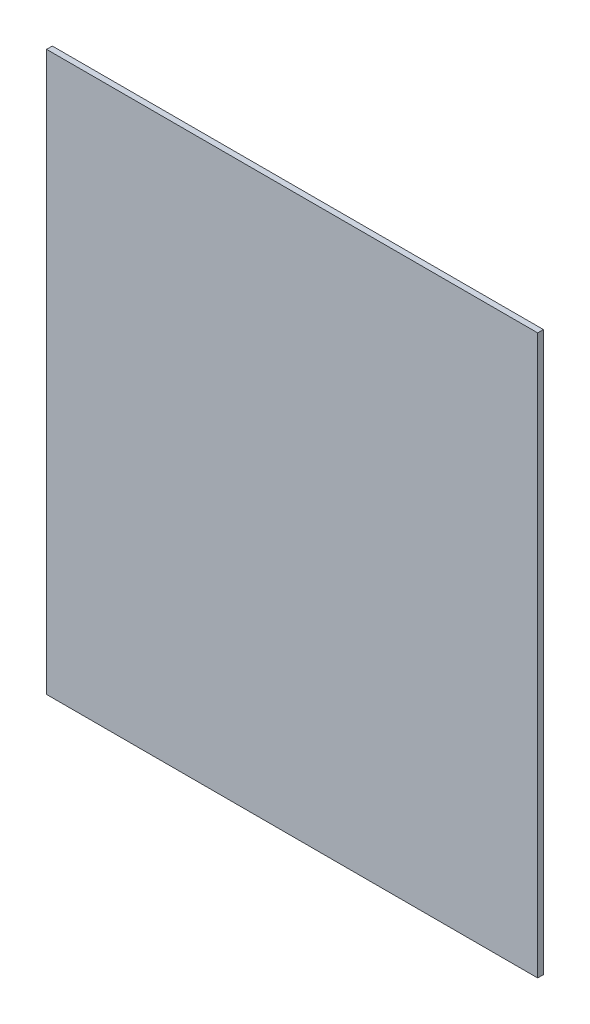
ISO-10303-21;
HEADER;
FILE_DESCRIPTION(('STEP AP214'),'2;1');
FILE_NAME('part.step','',(''),(''),'','','');
FILE_SCHEMA(('AUTOMOTIVE_DESIGN { 1 0 10303 214 1 1 1 1 }'));
ENDSEC;
DATA;
#1=APPLICATION_CONTEXT('core data for automotive mechanical design processes');
#2=APPLICATION_PROTOCOL_DEFINITION('international standard','automotive_design',2000,#1);
#3=PRODUCT_CONTEXT('',#1,'mechanical');
#4=PRODUCT('Part','Part','',(#3));
#5=PRODUCT_RELATED_PRODUCT_CATEGORY('part','',(#4));
#6=PRODUCT_DEFINITION_FORMATION('','',#4);
#7=PRODUCT_DEFINITION_CONTEXT('part definition',#1,'design');
#8=PRODUCT_DEFINITION('design','',#6,#7);
#9=PRODUCT_DEFINITION_SHAPE('','',#8);
#10=(LENGTH_UNIT() NAMED_UNIT(*) SI_UNIT(.MILLI.,.METRE.));
#11=(NAMED_UNIT(*) PLANE_ANGLE_UNIT() SI_UNIT($,.RADIAN.));
#12=(NAMED_UNIT(*) SI_UNIT($,.STERADIAN.) SOLID_ANGLE_UNIT());
#13=UNCERTAINTY_MEASURE_WITH_UNIT(LENGTH_MEASURE(1.E-05),#10,'distance_accuracy_value','');
#14=(GEOMETRIC_REPRESENTATION_CONTEXT(3) GLOBAL_UNCERTAINTY_ASSIGNED_CONTEXT((#13)) GLOBAL_UNIT_ASSIGNED_CONTEXT((#10,
#11,#12)) REPRESENTATION_CONTEXT('',''));
#15=CARTESIAN_POINT('',(0.,0.,0.));
#16=DIRECTION('',(0.,0.,1.));
#17=DIRECTION('',(1.,0.,0.));
#18=AXIS2_PLACEMENT_3D('',#15,#16,#17);
#19=CARTESIAN_POINT('',(92.3517414370708,193.171224832215,3.));
#20=DIRECTION('',(-1.,0.,0.));
#21=DIRECTION('',(0.,-1.,0.));
#22=AXIS2_PLACEMENT_3D('',#19,#20,#21);
#23=PLANE('',#22);
#24=DIRECTION('',(0.,1.,0.));
#25=VECTOR('',#24,1.);
#26=CARTESIAN_POINT('',(92.3517414370708,193.171224832215,0.));
#27=LINE('',#26,#25);
#28=CARTESIAN_POINT('',(92.3517414370709,-97.9287751677852,0.));
#29=VERTEX_POINT('',#28);
#30=CARTESIAN_POINT('',(92.3517414370708,193.171224832215,0.));
#31=VERTEX_POINT('',#30);
#32=EDGE_CURVE('E98',#29,#31,#27,.T.);
#33=ORIENTED_EDGE('',*,*,#32,.T.);
#34=DIRECTION('',(0.,0.,-1.));
#35=VECTOR('',#34,1.);
#36=CARTESIAN_POINT('',(92.3517414370708,193.171224832215,3.));
#37=LINE('',#36,#35);
#38=CARTESIAN_POINT('',(92.3517414370708,193.171224832215,3.));
#39=VERTEX_POINT('',#38);
#40=EDGE_CURVE('E11',#39,#31,#37,.T.);
#41=ORIENTED_EDGE('',*,*,#40,.F.);
#42=DIRECTION('',(0.,1.,0.));
#43=VECTOR('',#42,1.);
#44=CARTESIAN_POINT('',(92.3517414370708,193.171224832215,3.));
#45=LINE('',#44,#43);
#46=CARTESIAN_POINT('',(92.3517414370709,-97.9287751677852,3.));
#47=VERTEX_POINT('',#46);
#48=EDGE_CURVE('E86',#47,#39,#45,.T.);
#49=ORIENTED_EDGE('',*,*,#48,.F.);
#50=DIRECTION('',(0.,0.,-1.));
#51=VECTOR('',#50,1.);
#52=CARTESIAN_POINT('',(92.3517414370709,-97.9287751677852,3.));
#53=LINE('',#52,#51);
#54=EDGE_CURVE('E94',#47,#29,#53,.T.);
#55=ORIENTED_EDGE('',*,*,#54,.T.);
#56=EDGE_LOOP('',(#33,#41,#49,#55));
#57=FACE_BOUND('',#56,.T.);
#58=ADVANCED_FACE('F35',(#57),#23,.F.);
#59=CARTESIAN_POINT('',(-163.548258562929,193.171224832215,3.));
#60=DIRECTION('',(0.,-1.,0.));
#61=DIRECTION('',(0.,0.,-1.));
#62=AXIS2_PLACEMENT_3D('',#59,#60,#61);
#63=PLANE('',#62);
#64=DIRECTION('',(-1.,0.,0.));
#65=VECTOR('',#64,1.);
#66=CARTESIAN_POINT('',(-163.548258562929,193.171224832215,0.));
#67=LINE('',#66,#65);
#68=CARTESIAN_POINT('',(-163.548258562929,193.171224832215,0.));
#69=VERTEX_POINT('',#68);
#70=EDGE_CURVE('E90',#31,#69,#67,.T.);
#71=ORIENTED_EDGE('',*,*,#70,.T.);
#72=DIRECTION('',(0.,0.,-1.));
#73=VECTOR('',#72,1.);
#74=CARTESIAN_POINT('',(-163.548258562929,193.171224832215,3.));
#75=LINE('',#74,#73);
#76=CARTESIAN_POINT('',(-163.548258562929,193.171224832215,3.));
#77=VERTEX_POINT('',#76);
#78=EDGE_CURVE('E43',#77,#69,#75,.T.);
#79=ORIENTED_EDGE('',*,*,#78,.F.);
#80=DIRECTION('',(-1.,0.,0.));
#81=VECTOR('',#80,1.);
#82=CARTESIAN_POINT('',(-163.548258562929,193.171224832215,3.));
#83=LINE('',#82,#81);
#84=EDGE_CURVE('E81',#39,#77,#83,.T.);
#85=ORIENTED_EDGE('',*,*,#84,.F.);
#86=ORIENTED_EDGE('',*,*,#40,.T.);
#87=EDGE_LOOP('',(#71,#79,#85,#86));
#88=FACE_BOUND('',#87,.T.);
#89=ADVANCED_FACE('F89',(#88),#63,.F.);
#90=CARTESIAN_POINT('',(-163.548258562929,193.171224832215,3.));
#91=DIRECTION('',(1.,0.,0.));
#92=DIRECTION('',(0.,0.,-1.));
#93=AXIS2_PLACEMENT_3D('',#90,#91,#92);
#94=PLANE('',#93);
#95=DIRECTION('',(0.,-1.,0.));
#96=VECTOR('',#95,1.);
#97=CARTESIAN_POINT('',(-163.548258562929,193.171224832215,0.));
#98=LINE('',#97,#96);
#99=CARTESIAN_POINT('',(-163.548258562929,-97.9287751677852,0.));
#100=VERTEX_POINT('',#99);
#101=EDGE_CURVE('E68',#69,#100,#98,.T.);
#102=ORIENTED_EDGE('',*,*,#101,.T.);
#103=DIRECTION('',(0.,0.,-1.));
#104=VECTOR('',#103,1.);
#105=CARTESIAN_POINT('',(-163.548258562929,-97.9287751677852,3.));
#106=LINE('',#105,#104);
#107=CARTESIAN_POINT('',(-163.548258562929,-97.9287751677852,3.));
#108=VERTEX_POINT('',#107);
#109=EDGE_CURVE('E91',#108,#100,#106,.T.);
#110=ORIENTED_EDGE('',*,*,#109,.F.);
#111=DIRECTION('',(0.,-1.,0.));
#112=VECTOR('',#111,1.);
#113=CARTESIAN_POINT('',(-163.548258562929,193.171224832215,3.));
#114=LINE('',#113,#112);
#115=EDGE_CURVE('E84',#77,#108,#114,.T.);
#116=ORIENTED_EDGE('',*,*,#115,.F.);
#117=ORIENTED_EDGE('',*,*,#78,.T.);
#118=EDGE_LOOP('',(#102,#110,#116,#117));
#119=FACE_BOUND('',#118,.T.);
#120=ADVANCED_FACE('F92',(#119),#94,.F.);
#121=CARTESIAN_POINT('',(-163.548258562929,-97.9287751677852,3.));
#122=DIRECTION('',(0.,1.,0.));
#123=DIRECTION('',(0.,0.,1.));
#124=AXIS2_PLACEMENT_3D('',#121,#122,#123);
#125=PLANE('',#124);
#126=DIRECTION('',(1.,0.,0.));
#127=VECTOR('',#126,1.);
#128=CARTESIAN_POINT('',(-163.548258562929,-97.9287751677852,0.));
#129=LINE('',#128,#127);
#130=EDGE_CURVE('E74',#100,#29,#129,.T.);
#131=ORIENTED_EDGE('',*,*,#130,.T.);
#132=ORIENTED_EDGE('',*,*,#54,.F.);
#133=DIRECTION('',(1.,0.,0.));
#134=VECTOR('',#133,1.);
#135=CARTESIAN_POINT('',(-163.548258562929,-97.9287751677852,3.));
#136=LINE('',#135,#134);
#137=EDGE_CURVE('E51',#108,#47,#136,.T.);
#138=ORIENTED_EDGE('',*,*,#137,.F.);
#139=ORIENTED_EDGE('',*,*,#109,.T.);
#140=EDGE_LOOP('',(#131,#132,#138,#139));
#141=FACE_BOUND('',#140,.T.);
#142=ADVANCED_FACE('F105',(#141),#125,.F.);
#143=CARTESIAN_POINT('',(0.,0.,3.));
#144=DIRECTION('',(0.,0.,1.));
#145=DIRECTION('',(1.,0.,0.));
#146=AXIS2_PLACEMENT_3D('',#143,#144,#145);
#147=PLANE('',#146);
#148=ORIENTED_EDGE('',*,*,#48,.T.);
#149=ORIENTED_EDGE('',*,*,#84,.T.);
#150=ORIENTED_EDGE('',*,*,#115,.T.);
#151=ORIENTED_EDGE('',*,*,#137,.T.);
#152=EDGE_LOOP('',(#148,#149,#150,#151));
#153=FACE_BOUND('',#152,.T.);
#154=ADVANCED_FACE('F82',(#153),#147,.T.);
#155=CARTESIAN_POINT('',(0.,0.,0.));
#156=DIRECTION('',(0.,0.,1.));
#157=DIRECTION('',(1.,0.,0.));
#158=AXIS2_PLACEMENT_3D('',#155,#156,#157);
#159=PLANE('',#158);
#160=ORIENTED_EDGE('',*,*,#32,.F.);
#161=ORIENTED_EDGE('',*,*,#130,.F.);
#162=ORIENTED_EDGE('',*,*,#101,.F.);
#163=ORIENTED_EDGE('',*,*,#70,.F.);
#164=EDGE_LOOP('',(#160,#161,#162,#163));
#165=FACE_BOUND('',#164,.T.);
#166=ADVANCED_FACE('F108',(#165),#159,.F.);
#167=CLOSED_SHELL('',(#58,#89,#120,#142,#154,#166));
#168=MANIFOLD_SOLID_BREP('B2',#167);
#169=ADVANCED_BREP_SHAPE_REPRESENTATION('',(#18,#168),#14);
#170=SHAPE_DEFINITION_REPRESENTATION(#9,#169);
ENDSEC;
END-ISO-10303-21;
